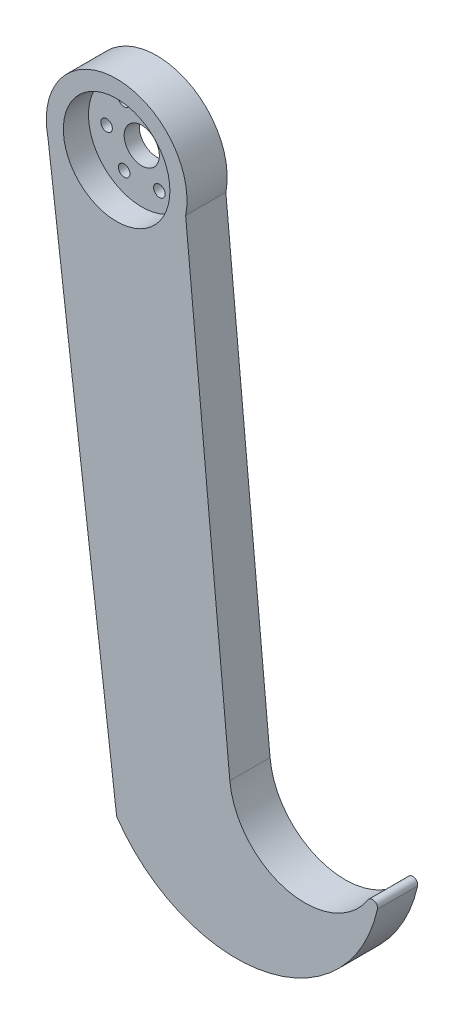
ISO-10303-21;
HEADER;
FILE_DESCRIPTION(('STEP AP214'),'2;1');
FILE_NAME('part.step','',(''),(''),'','','');
FILE_SCHEMA(('AUTOMOTIVE_DESIGN { 1 0 10303 214 1 1 1 1 }'));
ENDSEC;
DATA;
#1=APPLICATION_CONTEXT('core data for automotive mechanical design processes');
#2=APPLICATION_PROTOCOL_DEFINITION('international standard','automotive_design',2000,#1);
#3=PRODUCT_CONTEXT('',#1,'mechanical');
#4=PRODUCT('Part','Part','',(#3));
#5=PRODUCT_RELATED_PRODUCT_CATEGORY('part','',(#4));
#6=PRODUCT_DEFINITION_FORMATION('','',#4);
#7=PRODUCT_DEFINITION_CONTEXT('part definition',#1,'design');
#8=PRODUCT_DEFINITION('design','',#6,#7);
#9=PRODUCT_DEFINITION_SHAPE('','',#8);
#10=(LENGTH_UNIT() NAMED_UNIT(*) SI_UNIT(.MILLI.,.METRE.));
#11=(NAMED_UNIT(*) PLANE_ANGLE_UNIT() SI_UNIT($,.RADIAN.));
#12=(NAMED_UNIT(*) SI_UNIT($,.STERADIAN.) SOLID_ANGLE_UNIT());
#13=UNCERTAINTY_MEASURE_WITH_UNIT(LENGTH_MEASURE(1.E-05),#10,'distance_accuracy_value','');
#14=(GEOMETRIC_REPRESENTATION_CONTEXT(3) GLOBAL_UNCERTAINTY_ASSIGNED_CONTEXT((#13)) GLOBAL_UNIT_ASSIGNED_CONTEXT((#10,
#11,#12)) REPRESENTATION_CONTEXT('',''));
#15=CARTESIAN_POINT('',(0.,0.,0.));
#16=DIRECTION('',(0.,0.,1.));
#17=DIRECTION('',(1.,0.,0.));
#18=AXIS2_PLACEMENT_3D('',#15,#16,#17);
#19=CARTESIAN_POINT('',(0.,0.,-2.));
#20=DIRECTION('',(0.,0.,1.));
#21=DIRECTION('',(1.,0.,0.));
#22=AXIS2_PLACEMENT_3D('',#19,#20,#21);
#23=CYLINDRICAL_SURFACE('',#22,3.5);
#24=CARTESIAN_POINT('',(0.,0.,0.));
#25=DIRECTION('',(0.,0.,1.));
#26=DIRECTION('',(1.,0.,0.));
#27=AXIS2_PLACEMENT_3D('',#24,#25,#26);
#28=CIRCLE('',#27,3.5);
#29=CARTESIAN_POINT('',(3.5,0.,0.));
#30=VERTEX_POINT('',#29);
#31=EDGE_CURVE('E131',#30,#30,#28,.T.);
#32=ORIENTED_EDGE('',*,*,#31,.F.);
#33=EDGE_LOOP('',(#32));
#34=FACE_BOUND('',#33,.T.);
#35=CARTESIAN_POINT('',(0.,0.,3.));
#36=DIRECTION('',(0.,0.,1.));
#37=DIRECTION('',(1.,0.,0.));
#38=AXIS2_PLACEMENT_3D('',#35,#36,#37);
#39=CIRCLE('',#38,3.5);
#40=CARTESIAN_POINT('',(3.5,0.,3.));
#41=VERTEX_POINT('',#40);
#42=EDGE_CURVE('E37',#41,#41,#39,.F.);
#43=ORIENTED_EDGE('',*,*,#42,.F.);
#44=EDGE_LOOP('',(#43));
#45=FACE_BOUND('',#44,.T.);
#46=ADVANCED_FACE('F33',(#34,#45),#23,.F.);
#47=CARTESIAN_POINT('',(0.,0.,8.));
#48=DIRECTION('',(0.,0.,-1.));
#49=DIRECTION('',(-1.,0.,0.));
#50=AXIS2_PLACEMENT_3D('',#47,#48,#49);
#51=CYLINDRICAL_SURFACE('',#50,14.);
#52=CARTESIAN_POINT('',(0.,0.,8.));
#53=DIRECTION('',(0.,0.,1.));
#54=DIRECTION('',(1.,0.,0.));
#55=AXIS2_PLACEMENT_3D('',#52,#53,#54);
#56=CIRCLE('',#55,14.);
#57=CARTESIAN_POINT('',(13.7355783574531,-2.70811506148946,8.));
#58=VERTEX_POINT('',#57);
#59=CARTESIAN_POINT('',(-13.6489972699894,-3.11526459932731,8.));
#60=VERTEX_POINT('',#59);
#61=EDGE_CURVE('E133',#58,#60,#56,.T.);
#62=ORIENTED_EDGE('',*,*,#61,.F.);
#63=DIRECTION('',(0.,0.,1.));
#64=VECTOR('',#63,1.);
#65=CARTESIAN_POINT('',(13.7355783574531,-2.70811506148946,0.));
#66=LINE('',#65,#64);
#67=CARTESIAN_POINT('',(13.7355783574531,-2.70811506148946,0.));
#68=VERTEX_POINT('',#67);
#69=EDGE_CURVE('E112',#68,#58,#66,.T.);
#70=ORIENTED_EDGE('',*,*,#69,.F.);
#71=CARTESIAN_POINT('',(0.,0.,0.));
#72=DIRECTION('',(0.,0.,1.));
#73=DIRECTION('',(1.,0.,0.));
#74=AXIS2_PLACEMENT_3D('',#71,#72,#73);
#75=CIRCLE('',#74,14.);
#76=CARTESIAN_POINT('',(-13.6489972699894,-3.11526459932731,0.));
#77=VERTEX_POINT('',#76);
#78=EDGE_CURVE('E117',#68,#77,#75,.T.);
#79=ORIENTED_EDGE('',*,*,#78,.T.);
#80=DIRECTION('',(0.,0.,1.));
#81=VECTOR('',#80,1.);
#82=CARTESIAN_POINT('',(-13.6489972699894,-3.11526459932734,0.));
#83=LINE('',#82,#81);
#84=EDGE_CURVE('E113',#77,#60,#83,.T.);
#85=ORIENTED_EDGE('',*,*,#84,.T.);
#86=EDGE_LOOP('',(#62,#70,#79,#85));
#87=FACE_BOUND('',#86,.T.);
#88=ADVANCED_FACE('F161',(#87),#51,.T.);
#89=CARTESIAN_POINT('',(0.,0.,8.));
#90=DIRECTION('',(0.,0.,1.));
#91=DIRECTION('',(1.,0.,0.));
#92=AXIS2_PLACEMENT_3D('',#89,#90,#91);
#93=PLANE('',#92);
#94=CARTESIAN_POINT('',(0.,0.,8.));
#95=DIRECTION('',(0.,0.,1.));
#96=DIRECTION('',(1.,0.,0.));
#97=AXIS2_PLACEMENT_3D('',#94,#95,#96);
#98=CIRCLE('',#97,10.6);
#99=CARTESIAN_POINT('',(10.6,0.,8.));
#100=VERTEX_POINT('',#99);
#101=EDGE_CURVE('E164',#100,#100,#98,.T.);
#102=ORIENTED_EDGE('',*,*,#101,.F.);
#103=EDGE_LOOP('',(#102));
#104=FACE_BOUND('',#103,.T.);
#105=DIRECTION('',(0.123137483900924,-0.992389621095742,0.));
#106=VECTOR('',#105,1.);
#107=CARTESIAN_POINT('',(-13.6489972699894,-3.11526459932734,8.));
#108=LINE('',#107,#106);
#109=CARTESIAN_POINT('',(-0.0300732699647852,-112.872898099379,8.));
#110=VERTEX_POINT('',#109);
#111=EDGE_CURVE('E123',#60,#110,#108,.T.);
#112=ORIENTED_EDGE('',*,*,#111,.T.);
#113=CARTESIAN_POINT('',(0.962316351130953,-112.749760615478,8.));
#114=DIRECTION('',(0.,0.,1.));
#115=DIRECTION('',(1.,0.,0.));
#116=AXIS2_PLACEMENT_3D('',#113,#114,#115);
#117=CIRCLE('',#116,1.);
#118=CARTESIAN_POINT('',(0.140884053214486,-113.320066656074,8.));
#119=VERTEX_POINT('',#118);
#120=EDGE_CURVE('E56',#110,#119,#117,.T.);
#121=ORIENTED_EDGE('',*,*,#120,.T.);
#122=CARTESIAN_POINT('',(23.790257885744,-96.9007210968576,8.));
#123=DIRECTION('',(0.,0.,1.));
#124=DIRECTION('',(1.,0.,0.));
#125=AXIS2_PLACEMENT_3D('',#122,#123,#124);
#126=CIRCLE('',#125,28.7904114465856);
#127=CARTESIAN_POINT('',(51.8873570072006,-103.180913149871,8.));
#128=VERTEX_POINT('',#127);
#129=EDGE_CURVE('E125',#119,#128,#126,.T.);
#130=ORIENTED_EDGE('',*,*,#129,.T.);
#131=CARTESIAN_POINT('',(50.9114383693727,-102.962778300889,8.));
#132=DIRECTION('',(0.,0.,1.));
#133=DIRECTION('',(1.,0.,0.));
#134=AXIS2_PLACEMENT_3D('',#131,#132,#133);
#135=CIRCLE('',#134,1.);
#136=CARTESIAN_POINT('',(50.0708413942103,-102.42111722111,8.));
#137=VERTEX_POINT('',#136);
#138=EDGE_CURVE('E142',#128,#137,#135,.T.);
#139=ORIENTED_EDGE('',*,*,#138,.T.);
#140=CARTESIAN_POINT('',(37.4618867667754,-94.2962010244166,8.));
#141=DIRECTION('',(0.,0.,-1.));
#142=DIRECTION('',(1.,0.,0.));
#143=AXIS2_PLACEMENT_3D('',#140,#141,#142);
#144=CIRCLE('',#143,15.);
#145=CARTESIAN_POINT('',(22.5284846509842,-95.7081150614895,8.));
#146=VERTEX_POINT('',#145);
#147=EDGE_CURVE('E127',#137,#146,#144,.T.);
#148=ORIENTED_EDGE('',*,*,#147,.T.);
#149=DIRECTION('',(-0.0941276024715207,0.995560141052746,0.));
#150=VECTOR('',#149,1.);
#151=CARTESIAN_POINT('',(13.7355783574531,-2.70811506148946,8.));
#152=LINE('',#151,#150);
#153=EDGE_CURVE('E111',#146,#58,#152,.T.);
#154=ORIENTED_EDGE('',*,*,#153,.T.);
#155=ORIENTED_EDGE('',*,*,#61,.T.);
#156=EDGE_LOOP('',(#112,#121,#130,#139,#148,#154,#155));
#157=FACE_BOUND('',#156,.T.);
#158=ADVANCED_FACE('F159',(#104,#157),#93,.T.);
#159=CARTESIAN_POINT('',(0.,0.,0.));
#160=DIRECTION('',(0.,0.,1.));
#161=DIRECTION('',(1.,0.,0.));
#162=AXIS2_PLACEMENT_3D('',#159,#160,#161);
#163=PLANE('',#162);
#164=CARTESIAN_POINT('',(3.50000000000007,6.06217782649103,0.));
#165=DIRECTION('',(0.,0.,1.));
#166=DIRECTION('',(1.,0.,0.));
#167=AXIS2_PLACEMENT_3D('',#164,#165,#166);
#168=CIRCLE('',#167,1.15);
#169=CARTESIAN_POINT('',(4.65000000000007,6.06217782649103,0.));
#170=VERTEX_POINT('',#169);
#171=EDGE_CURVE('E200',#170,#170,#168,.T.);
#172=ORIENTED_EDGE('',*,*,#171,.T.);
#173=EDGE_LOOP('',(#172));
#174=FACE_BOUND('',#173,.T.);
#175=CARTESIAN_POINT('',(-3.49999999999994,6.06217782649111,0.));
#176=DIRECTION('',(0.,0.,1.));
#177=DIRECTION('',(1.,0.,0.));
#178=AXIS2_PLACEMENT_3D('',#175,#176,#177);
#179=CIRCLE('',#178,1.15);
#180=CARTESIAN_POINT('',(-2.34999999999994,6.06217782649111,0.));
#181=VERTEX_POINT('',#180);
#182=EDGE_CURVE('E194',#181,#181,#179,.T.);
#183=ORIENTED_EDGE('',*,*,#182,.T.);
#184=EDGE_LOOP('',(#183));
#185=FACE_BOUND('',#184,.T.);
#186=CARTESIAN_POINT('',(-7.,0.,0.));
#187=DIRECTION('',(0.,0.,1.));
#188=DIRECTION('',(1.,0.,0.));
#189=AXIS2_PLACEMENT_3D('',#186,#187,#188);
#190=CIRCLE('',#189,1.15);
#191=CARTESIAN_POINT('',(-5.85,0.,0.));
#192=VERTEX_POINT('',#191);
#193=EDGE_CURVE('E188',#192,#192,#190,.T.);
#194=ORIENTED_EDGE('',*,*,#193,.T.);
#195=EDGE_LOOP('',(#194));
#196=FACE_BOUND('',#195,.T.);
#197=CARTESIAN_POINT('',(-3.50000000000003,-6.06217782649106,0.));
#198=DIRECTION('',(0.,0.,1.));
#199=DIRECTION('',(1.,0.,0.));
#200=AXIS2_PLACEMENT_3D('',#197,#198,#199);
#201=CIRCLE('',#200,1.15);
#202=CARTESIAN_POINT('',(-2.35000000000003,-6.06217782649106,0.));
#203=VERTEX_POINT('',#202);
#204=EDGE_CURVE('E182',#203,#203,#201,.T.);
#205=ORIENTED_EDGE('',*,*,#204,.T.);
#206=EDGE_LOOP('',(#205));
#207=FACE_BOUND('',#206,.T.);
#208=CARTESIAN_POINT('',(3.49999999999999,-6.06217782649108,0.));
#209=DIRECTION('',(0.,0.,1.));
#210=DIRECTION('',(1.,0.,0.));
#211=AXIS2_PLACEMENT_3D('',#208,#209,#210);
#212=CIRCLE('',#211,1.15);
#213=CARTESIAN_POINT('',(4.64999999999999,-6.06217782649108,0.));
#214=VERTEX_POINT('',#213);
#215=EDGE_CURVE('E176',#214,#214,#212,.T.);
#216=ORIENTED_EDGE('',*,*,#215,.T.);
#217=EDGE_LOOP('',(#216));
#218=FACE_BOUND('',#217,.T.);
#219=CARTESIAN_POINT('',(7.,0.,0.));
#220=DIRECTION('',(0.,0.,1.));
#221=DIRECTION('',(1.,0.,0.));
#222=AXIS2_PLACEMENT_3D('',#219,#220,#221);
#223=CIRCLE('',#222,1.15);
#224=CARTESIAN_POINT('',(8.15,0.,0.));
#225=VERTEX_POINT('',#224);
#226=EDGE_CURVE('E168',#225,#225,#223,.T.);
#227=ORIENTED_EDGE('',*,*,#226,.T.);
#228=EDGE_LOOP('',(#227));
#229=FACE_BOUND('',#228,.T.);
#230=ORIENTED_EDGE('',*,*,#31,.T.);
#231=EDGE_LOOP('',(#230));
#232=FACE_BOUND('',#231,.T.);
#233=CARTESIAN_POINT('',(23.790257885744,-96.9007210968576,0.));
#234=DIRECTION('',(0.,0.,1.));
#235=DIRECTION('',(1.,0.,0.));
#236=AXIS2_PLACEMENT_3D('',#233,#234,#235);
#237=CIRCLE('',#236,28.7904114465856);
#238=CARTESIAN_POINT('',(0.140884053214486,-113.320066656074,0.));
#239=VERTEX_POINT('',#238);
#240=CARTESIAN_POINT('',(51.8873570072006,-103.180913149871,0.));
#241=VERTEX_POINT('',#240);
#242=EDGE_CURVE('E104',#239,#241,#237,.T.);
#243=ORIENTED_EDGE('',*,*,#242,.F.);
#244=CARTESIAN_POINT('',(0.962316351130953,-112.749760615478,0.));
#245=DIRECTION('',(0.,0.,1.));
#246=DIRECTION('',(1.,0.,0.));
#247=AXIS2_PLACEMENT_3D('',#244,#245,#246);
#248=CIRCLE('',#247,1.);
#249=CARTESIAN_POINT('',(-0.0300732699647852,-112.872898099379,0.));
#250=VERTEX_POINT('',#249);
#251=EDGE_CURVE('E11',#239,#250,#248,.F.);
#252=ORIENTED_EDGE('',*,*,#251,.T.);
#253=DIRECTION('',(0.123137483900924,-0.992389621095742,0.));
#254=VECTOR('',#253,1.);
#255=CARTESIAN_POINT('',(-13.6489972699894,-3.11526459932734,0.));
#256=LINE('',#255,#254);
#257=EDGE_CURVE('E130',#77,#250,#256,.T.);
#258=ORIENTED_EDGE('',*,*,#257,.F.);
#259=ORIENTED_EDGE('',*,*,#78,.F.);
#260=DIRECTION('',(-0.0941276024715207,0.995560141052746,0.));
#261=VECTOR('',#260,1.);
#262=CARTESIAN_POINT('',(13.7355783574531,-2.70811506148946,0.));
#263=LINE('',#262,#261);
#264=CARTESIAN_POINT('',(22.5284846509842,-95.7081150614895,0.));
#265=VERTEX_POINT('',#264);
#266=EDGE_CURVE('E103',#265,#68,#263,.T.);
#267=ORIENTED_EDGE('',*,*,#266,.F.);
#268=CARTESIAN_POINT('',(37.4618867667754,-94.2962010244166,0.));
#269=DIRECTION('',(0.,0.,-1.));
#270=DIRECTION('',(1.,0.,0.));
#271=AXIS2_PLACEMENT_3D('',#268,#269,#270);
#272=CIRCLE('',#271,15.);
#273=CARTESIAN_POINT('',(50.0708413942103,-102.42111722111,0.));
#274=VERTEX_POINT('',#273);
#275=EDGE_CURVE('E91',#274,#265,#272,.T.);
#276=ORIENTED_EDGE('',*,*,#275,.F.);
#277=CARTESIAN_POINT('',(50.9114383693727,-102.962778300889,0.));
#278=DIRECTION('',(0.,0.,1.));
#279=DIRECTION('',(1.,0.,0.));
#280=AXIS2_PLACEMENT_3D('',#277,#278,#279);
#281=CIRCLE('',#280,1.);
#282=EDGE_CURVE('E145',#274,#241,#281,.F.);
#283=ORIENTED_EDGE('',*,*,#282,.T.);
#284=EDGE_LOOP('',(#243,#252,#258,#259,#267,#276,#283));
#285=FACE_BOUND('',#284,.T.);
#286=ADVANCED_FACE('F115',(#174,#185,#196,#207,#218,#229,#232,#285),#163,.F.);
#287=CARTESIAN_POINT('',(13.7355783574531,-2.70811506148946,0.));
#288=DIRECTION('',(0.995560141052746,0.0941276024715207,0.));
#289=DIRECTION('',(-0.0941276024715207,0.995560141052746,0.));
#290=AXIS2_PLACEMENT_3D('',#287,#288,#289);
#291=PLANE('',#290);
#292=ORIENTED_EDGE('',*,*,#153,.F.);
#293=DIRECTION('',(0.,0.,1.));
#294=VECTOR('',#293,1.);
#295=CARTESIAN_POINT('',(22.5284846509842,-95.7081150614895,0.));
#296=LINE('',#295,#294);
#297=EDGE_CURVE('E95',#265,#146,#296,.T.);
#298=ORIENTED_EDGE('',*,*,#297,.F.);
#299=ORIENTED_EDGE('',*,*,#266,.T.);
#300=ORIENTED_EDGE('',*,*,#69,.T.);
#301=EDGE_LOOP('',(#292,#298,#299,#300));
#302=FACE_BOUND('',#301,.T.);
#303=ADVANCED_FACE('F108',(#302),#291,.T.);
#304=CARTESIAN_POINT('',(37.4618867667754,-94.2962010244166,0.));
#305=DIRECTION('',(0.,0.,1.));
#306=DIRECTION('',(1.,0.,0.));
#307=AXIS2_PLACEMENT_3D('',#304,#305,#306);
#308=CYLINDRICAL_SURFACE('',#307,15.);
#309=ORIENTED_EDGE('',*,*,#147,.F.);
#310=DIRECTION('',(0.,0.,1.));
#311=VECTOR('',#310,1.);
#312=CARTESIAN_POINT('',(50.0708413942103,-102.42111722111,0.));
#313=LINE('',#312,#311);
#314=EDGE_CURVE('E98',#137,#274,#313,.F.);
#315=ORIENTED_EDGE('',*,*,#314,.T.);
#316=ORIENTED_EDGE('',*,*,#275,.T.);
#317=ORIENTED_EDGE('',*,*,#297,.T.);
#318=EDGE_LOOP('',(#309,#315,#316,#317));
#319=FACE_BOUND('',#318,.T.);
#320=ADVANCED_FACE('F94',(#319),#308,.F.);
#321=CARTESIAN_POINT('',(23.790257885744,-96.9007210968576,0.));
#322=DIRECTION('',(0.,0.,1.));
#323=DIRECTION('',(1.,0.,0.));
#324=AXIS2_PLACEMENT_3D('',#321,#322,#323);
#325=CYLINDRICAL_SURFACE('',#324,28.7904114465856);
#326=ORIENTED_EDGE('',*,*,#129,.F.);
#327=DIRECTION('',(0.,0.,1.));
#328=VECTOR('',#327,1.);
#329=CARTESIAN_POINT('',(0.140884053214489,-113.320066656074,0.));
#330=LINE('',#329,#328);
#331=EDGE_CURVE('E42',#119,#239,#330,.F.);
#332=ORIENTED_EDGE('',*,*,#331,.T.);
#333=ORIENTED_EDGE('',*,*,#242,.T.);
#334=DIRECTION('',(0.,0.,1.));
#335=VECTOR('',#334,1.);
#336=CARTESIAN_POINT('',(51.8873570072006,-103.180913149871,0.));
#337=LINE('',#336,#335);
#338=EDGE_CURVE('E136',#241,#128,#337,.T.);
#339=ORIENTED_EDGE('',*,*,#338,.T.);
#340=EDGE_LOOP('',(#326,#332,#333,#339));
#341=FACE_BOUND('',#340,.T.);
#342=ADVANCED_FACE('F253',(#341),#325,.T.);
#343=CARTESIAN_POINT('',(-13.6489972699894,-3.11526459932734,0.));
#344=DIRECTION('',(-0.992389621095742,-0.123137483900924,0.));
#345=DIRECTION('',(0.123137483900924,-0.992389621095742,0.));
#346=AXIS2_PLACEMENT_3D('',#343,#344,#345);
#347=PLANE('',#346);
#348=ORIENTED_EDGE('',*,*,#257,.T.);
#349=DIRECTION('',(0.,0.,1.));
#350=VECTOR('',#349,1.);
#351=CARTESIAN_POINT('',(-0.0300732699647886,-112.872898099379,0.));
#352=LINE('',#351,#350);
#353=EDGE_CURVE('E147',#250,#110,#352,.T.);
#354=ORIENTED_EDGE('',*,*,#353,.T.);
#355=ORIENTED_EDGE('',*,*,#111,.F.);
#356=ORIENTED_EDGE('',*,*,#84,.F.);
#357=EDGE_LOOP('',(#348,#354,#355,#356));
#358=FACE_BOUND('',#357,.T.);
#359=ADVANCED_FACE('F155',(#358),#347,.T.);
#360=CARTESIAN_POINT('',(50.9114383693727,-102.962778300889,0.));
#361=DIRECTION('',(0.,0.,-1.));
#362=DIRECTION('',(-1.,0.,0.));
#363=AXIS2_PLACEMENT_3D('',#360,#361,#362);
#364=CYLINDRICAL_SURFACE('',#363,1.);
#365=ORIENTED_EDGE('',*,*,#282,.F.);
#366=ORIENTED_EDGE('',*,*,#314,.F.);
#367=ORIENTED_EDGE('',*,*,#138,.F.);
#368=ORIENTED_EDGE('',*,*,#338,.F.);
#369=EDGE_LOOP('',(#365,#366,#367,#368));
#370=FACE_BOUND('',#369,.T.);
#371=ADVANCED_FACE('F246',(#370),#364,.T.);
#372=CARTESIAN_POINT('',(0.962316351130953,-112.749760615478,0.));
#373=DIRECTION('',(0.,0.,1.));
#374=DIRECTION('',(1.,0.,0.));
#375=AXIS2_PLACEMENT_3D('',#372,#373,#374);
#376=CYLINDRICAL_SURFACE('',#375,1.);
#377=ORIENTED_EDGE('',*,*,#251,.F.);
#378=ORIENTED_EDGE('',*,*,#331,.F.);
#379=ORIENTED_EDGE('',*,*,#120,.F.);
#380=ORIENTED_EDGE('',*,*,#353,.F.);
#381=EDGE_LOOP('',(#377,#378,#379,#380));
#382=FACE_BOUND('',#381,.T.);
#383=ADVANCED_FACE('F35',(#382),#376,.T.);
#384=CARTESIAN_POINT('',(0.,0.,3.));
#385=DIRECTION('',(0.,0.,1.));
#386=DIRECTION('',(1.,0.,0.));
#387=AXIS2_PLACEMENT_3D('',#384,#385,#386);
#388=PLANE('',#387);
#389=CARTESIAN_POINT('',(3.50000000000007,6.06217782649103,3.));
#390=DIRECTION('',(0.,0.,1.));
#391=DIRECTION('',(1.,0.,0.));
#392=AXIS2_PLACEMENT_3D('',#389,#390,#391);
#393=CIRCLE('',#392,1.15);
#394=CARTESIAN_POINT('',(4.65000000000007,6.06217782649103,3.));
#395=VERTEX_POINT('',#394);
#396=EDGE_CURVE('E203',#395,#395,#393,.T.);
#397=ORIENTED_EDGE('',*,*,#396,.F.);
#398=EDGE_LOOP('',(#397));
#399=FACE_BOUND('',#398,.T.);
#400=CARTESIAN_POINT('',(-3.49999999999994,6.06217782649111,3.));
#401=DIRECTION('',(0.,0.,1.));
#402=DIRECTION('',(1.,0.,0.));
#403=AXIS2_PLACEMENT_3D('',#400,#401,#402);
#404=CIRCLE('',#403,1.15);
#405=CARTESIAN_POINT('',(-2.34999999999994,6.06217782649111,3.));
#406=VERTEX_POINT('',#405);
#407=EDGE_CURVE('E197',#406,#406,#404,.T.);
#408=ORIENTED_EDGE('',*,*,#407,.F.);
#409=EDGE_LOOP('',(#408));
#410=FACE_BOUND('',#409,.T.);
#411=CARTESIAN_POINT('',(-7.,0.,3.));
#412=DIRECTION('',(0.,0.,1.));
#413=DIRECTION('',(1.,0.,0.));
#414=AXIS2_PLACEMENT_3D('',#411,#412,#413);
#415=CIRCLE('',#414,1.15);
#416=CARTESIAN_POINT('',(-5.85,0.,3.));
#417=VERTEX_POINT('',#416);
#418=EDGE_CURVE('E191',#417,#417,#415,.T.);
#419=ORIENTED_EDGE('',*,*,#418,.F.);
#420=EDGE_LOOP('',(#419));
#421=FACE_BOUND('',#420,.T.);
#422=CARTESIAN_POINT('',(-3.50000000000003,-6.06217782649106,3.));
#423=DIRECTION('',(0.,0.,1.));
#424=DIRECTION('',(1.,0.,0.));
#425=AXIS2_PLACEMENT_3D('',#422,#423,#424);
#426=CIRCLE('',#425,1.15);
#427=CARTESIAN_POINT('',(-2.35000000000003,-6.06217782649106,3.));
#428=VERTEX_POINT('',#427);
#429=EDGE_CURVE('E185',#428,#428,#426,.T.);
#430=ORIENTED_EDGE('',*,*,#429,.F.);
#431=EDGE_LOOP('',(#430));
#432=FACE_BOUND('',#431,.T.);
#433=CARTESIAN_POINT('',(3.49999999999999,-6.06217782649108,3.));
#434=DIRECTION('',(0.,0.,1.));
#435=DIRECTION('',(1.,0.,0.));
#436=AXIS2_PLACEMENT_3D('',#433,#434,#435);
#437=CIRCLE('',#436,1.15);
#438=CARTESIAN_POINT('',(4.64999999999999,-6.06217782649108,3.));
#439=VERTEX_POINT('',#438);
#440=EDGE_CURVE('E179',#439,#439,#437,.T.);
#441=ORIENTED_EDGE('',*,*,#440,.F.);
#442=EDGE_LOOP('',(#441));
#443=FACE_BOUND('',#442,.T.);
#444=CARTESIAN_POINT('',(7.,0.,3.));
#445=DIRECTION('',(0.,0.,1.));
#446=DIRECTION('',(1.,0.,0.));
#447=AXIS2_PLACEMENT_3D('',#444,#445,#446);
#448=CIRCLE('',#447,1.15);
#449=CARTESIAN_POINT('',(8.15,0.,3.));
#450=VERTEX_POINT('',#449);
#451=EDGE_CURVE('E173',#450,#450,#448,.T.);
#452=ORIENTED_EDGE('',*,*,#451,.F.);
#453=EDGE_LOOP('',(#452));
#454=FACE_BOUND('',#453,.T.);
#455=CARTESIAN_POINT('',(0.,0.,3.));
#456=DIRECTION('',(0.,0.,1.));
#457=DIRECTION('',(1.,0.,0.));
#458=AXIS2_PLACEMENT_3D('',#455,#456,#457);
#459=CIRCLE('',#458,10.6);
#460=CARTESIAN_POINT('',(10.6,0.,3.));
#461=VERTEX_POINT('',#460);
#462=EDGE_CURVE('E167',#461,#461,#459,.T.);
#463=ORIENTED_EDGE('',*,*,#462,.T.);
#464=EDGE_LOOP('',(#463));
#465=FACE_BOUND('',#464,.T.);
#466=ORIENTED_EDGE('',*,*,#42,.T.);
#467=EDGE_LOOP('',(#466));
#468=FACE_BOUND('',#467,.T.);
#469=ADVANCED_FACE('F210',(#399,#410,#421,#432,#443,#454,#465,#468),#388,.T.);
#470=CARTESIAN_POINT('',(0.,0.,3.));
#471=DIRECTION('',(0.,0.,1.));
#472=DIRECTION('',(1.,0.,0.));
#473=AXIS2_PLACEMENT_3D('',#470,#471,#472);
#474=CYLINDRICAL_SURFACE('',#473,10.6);
#475=ORIENTED_EDGE('',*,*,#462,.F.);
#476=EDGE_LOOP('',(#475));
#477=FACE_BOUND('',#476,.T.);
#478=ORIENTED_EDGE('',*,*,#101,.T.);
#479=EDGE_LOOP('',(#478));
#480=FACE_BOUND('',#479,.T.);
#481=ADVANCED_FACE('F213',(#477,#480),#474,.F.);
#482=CARTESIAN_POINT('',(7.,0.,-2.));
#483=DIRECTION('',(0.,0.,1.));
#484=DIRECTION('',(1.,0.,0.));
#485=AXIS2_PLACEMENT_3D('',#482,#483,#484);
#486=CYLINDRICAL_SURFACE('',#485,1.15);
#487=ORIENTED_EDGE('',*,*,#451,.T.);
#488=EDGE_LOOP('',(#487));
#489=FACE_BOUND('',#488,.T.);
#490=ORIENTED_EDGE('',*,*,#226,.F.);
#491=EDGE_LOOP('',(#490));
#492=FACE_BOUND('',#491,.T.);
#493=ADVANCED_FACE('F265',(#489,#492),#486,.F.);
#494=CARTESIAN_POINT('',(3.49999999999999,-6.06217782649108,-2.));
#495=DIRECTION('',(0.,0.,1.));
#496=DIRECTION('',(1.,0.,0.));
#497=AXIS2_PLACEMENT_3D('',#494,#495,#496);
#498=CYLINDRICAL_SURFACE('',#497,1.15);
#499=ORIENTED_EDGE('',*,*,#440,.T.);
#500=EDGE_LOOP('',(#499));
#501=FACE_BOUND('',#500,.T.);
#502=ORIENTED_EDGE('',*,*,#215,.F.);
#503=EDGE_LOOP('',(#502));
#504=FACE_BOUND('',#503,.T.);
#505=ADVANCED_FACE('F270',(#501,#504),#498,.F.);
#506=CARTESIAN_POINT('',(-3.50000000000003,-6.06217782649106,-2.));
#507=DIRECTION('',(0.,0.,1.));
#508=DIRECTION('',(1.,0.,0.));
#509=AXIS2_PLACEMENT_3D('',#506,#507,#508);
#510=CYLINDRICAL_SURFACE('',#509,1.15);
#511=ORIENTED_EDGE('',*,*,#429,.T.);
#512=EDGE_LOOP('',(#511));
#513=FACE_BOUND('',#512,.T.);
#514=ORIENTED_EDGE('',*,*,#204,.F.);
#515=EDGE_LOOP('',(#514));
#516=FACE_BOUND('',#515,.T.);
#517=ADVANCED_FACE('F274',(#513,#516),#510,.F.);
#518=CARTESIAN_POINT('',(-7.,0.,-2.));
#519=DIRECTION('',(0.,0.,1.));
#520=DIRECTION('',(1.,0.,0.));
#521=AXIS2_PLACEMENT_3D('',#518,#519,#520);
#522=CYLINDRICAL_SURFACE('',#521,1.15);
#523=ORIENTED_EDGE('',*,*,#418,.T.);
#524=EDGE_LOOP('',(#523));
#525=FACE_BOUND('',#524,.T.);
#526=ORIENTED_EDGE('',*,*,#193,.F.);
#527=EDGE_LOOP('',(#526));
#528=FACE_BOUND('',#527,.T.);
#529=ADVANCED_FACE('F278',(#525,#528),#522,.F.);
#530=CARTESIAN_POINT('',(-3.49999999999994,6.06217782649111,-2.));
#531=DIRECTION('',(0.,0.,1.));
#532=DIRECTION('',(1.,0.,0.));
#533=AXIS2_PLACEMENT_3D('',#530,#531,#532);
#534=CYLINDRICAL_SURFACE('',#533,1.15);
#535=ORIENTED_EDGE('',*,*,#407,.T.);
#536=EDGE_LOOP('',(#535));
#537=FACE_BOUND('',#536,.T.);
#538=ORIENTED_EDGE('',*,*,#182,.F.);
#539=EDGE_LOOP('',(#538));
#540=FACE_BOUND('',#539,.T.);
#541=ADVANCED_FACE('F282',(#537,#540),#534,.F.);
#542=CARTESIAN_POINT('',(3.50000000000007,6.06217782649103,-2.));
#543=DIRECTION('',(0.,0.,1.));
#544=DIRECTION('',(1.,0.,0.));
#545=AXIS2_PLACEMENT_3D('',#542,#543,#544);
#546=CYLINDRICAL_SURFACE('',#545,1.15);
#547=ORIENTED_EDGE('',*,*,#396,.T.);
#548=EDGE_LOOP('',(#547));
#549=FACE_BOUND('',#548,.T.);
#550=ORIENTED_EDGE('',*,*,#171,.F.);
#551=EDGE_LOOP('',(#550));
#552=FACE_BOUND('',#551,.T.);
#553=ADVANCED_FACE('F207',(#549,#552),#546,.F.);
#554=CLOSED_SHELL('',(#46,#88,#158,#286,#303,#320,#342,#359,#371,#383,#469,#481,#493,#505,#517,
#529,#541,#553));
#555=MANIFOLD_SOLID_BREP('B2',#554);
#556=ADVANCED_BREP_SHAPE_REPRESENTATION('',(#18,#555),#14);
#557=SHAPE_DEFINITION_REPRESENTATION(#9,#556);
ENDSEC;
END-ISO-10303-21;
